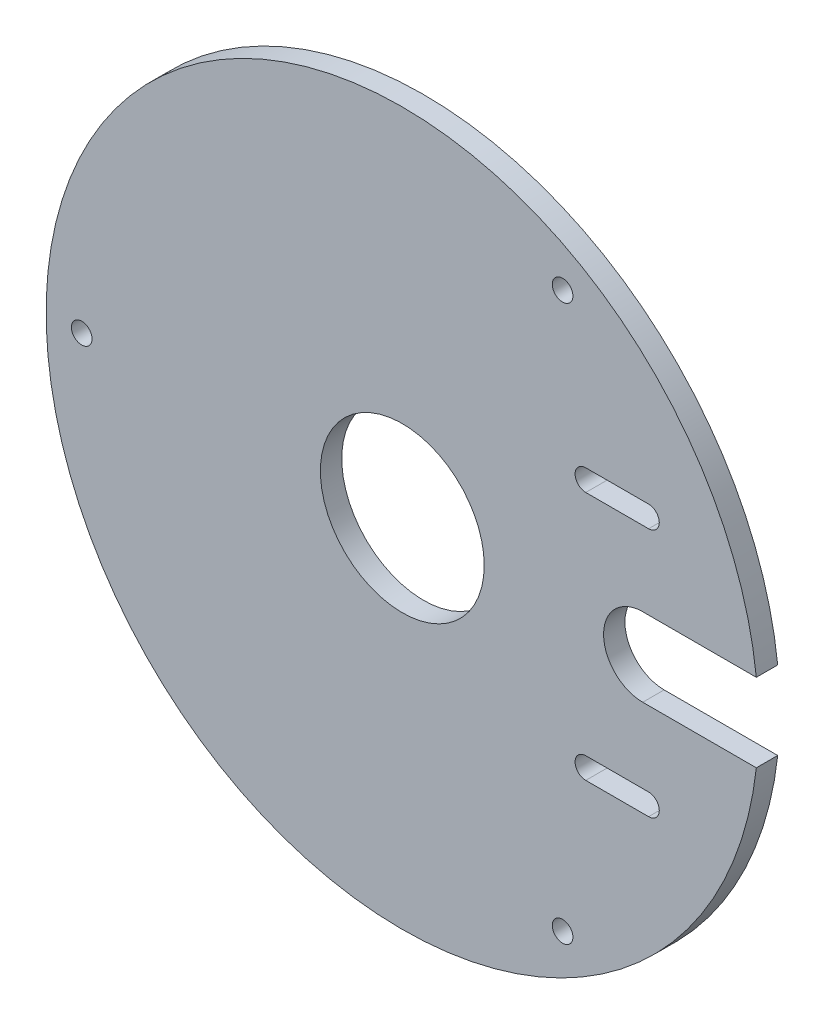
ISO-10303-21;
HEADER;
FILE_DESCRIPTION(('STEP AP214'),'2;1');
FILE_NAME('part.step','',(''),(''),'','','');
FILE_SCHEMA(('AUTOMOTIVE_DESIGN { 1 0 10303 214 1 1 1 1 }'));
ENDSEC;
DATA;
#1=APPLICATION_CONTEXT('core data for automotive mechanical design processes');
#2=APPLICATION_PROTOCOL_DEFINITION('international standard','automotive_design',2000,#1);
#3=PRODUCT_CONTEXT('',#1,'mechanical');
#4=PRODUCT('Part','Part','',(#3));
#5=PRODUCT_RELATED_PRODUCT_CATEGORY('part','',(#4));
#6=PRODUCT_DEFINITION_FORMATION('','',#4);
#7=PRODUCT_DEFINITION_CONTEXT('part definition',#1,'design');
#8=PRODUCT_DEFINITION('design','',#6,#7);
#9=PRODUCT_DEFINITION_SHAPE('','',#8);
#10=(LENGTH_UNIT() NAMED_UNIT(*) SI_UNIT(.MILLI.,.METRE.));
#11=(NAMED_UNIT(*) PLANE_ANGLE_UNIT() SI_UNIT($,.RADIAN.));
#12=(NAMED_UNIT(*) SI_UNIT($,.STERADIAN.) SOLID_ANGLE_UNIT());
#13=UNCERTAINTY_MEASURE_WITH_UNIT(LENGTH_MEASURE(1.E-05),#10,'distance_accuracy_value','');
#14=(GEOMETRIC_REPRESENTATION_CONTEXT(3) GLOBAL_UNCERTAINTY_ASSIGNED_CONTEXT((#13)) GLOBAL_UNIT_ASSIGNED_CONTEXT((#10,
#11,#12)) REPRESENTATION_CONTEXT('',''));
#15=CARTESIAN_POINT('',(0.,0.,0.));
#16=DIRECTION('',(0.,0.,1.));
#17=DIRECTION('',(1.,0.,0.));
#18=AXIS2_PLACEMENT_3D('',#15,#16,#17);
#19=CARTESIAN_POINT('',(0.,0.,3.));
#20=DIRECTION('',(0.,0.,1.));
#21=DIRECTION('',(1.,0.,0.));
#22=AXIS2_PLACEMENT_3D('',#19,#20,#21);
#23=PLANE('',#22);
#24=CARTESIAN_POINT('',(22.5000000000002,38.9711431702996,3.));
#25=DIRECTION('',(0.,0.,1.));
#26=DIRECTION('',(-0.500000000000004,-0.866025403784436,0.));
#27=AXIS2_PLACEMENT_3D('',#24,#25,#26);
#28=CIRCLE('',#27,1.45);
#29=CARTESIAN_POINT('',(21.7750000000002,37.7154063348122,3.));
#30=VERTEX_POINT('',#29);
#31=EDGE_CURVE('E286',#30,#30,#28,.T.);
#32=ORIENTED_EDGE('',*,*,#31,.F.);
#33=EDGE_LOOP('',(#32));
#34=FACE_BOUND('',#33,.T.);
#35=CARTESIAN_POINT('',(0.,0.,3.));
#36=DIRECTION('',(0.,0.,1.));
#37=DIRECTION('',(1.,0.,0.));
#38=AXIS2_PLACEMENT_3D('',#35,#36,#37);
#39=CIRCLE('',#38,11.5);
#40=CARTESIAN_POINT('',(11.5,0.,3.));
#41=VERTEX_POINT('',#40);
#42=EDGE_CURVE('E205',#41,#41,#39,.T.);
#43=ORIENTED_EDGE('',*,*,#42,.F.);
#44=EDGE_LOOP('',(#43));
#45=FACE_BOUND('',#44,.T.);
#46=DIRECTION('',(-1.,0.,0.));
#47=VECTOR('',#46,1.);
#48=CARTESIAN_POINT('',(0.,5.5,3.));
#49=LINE('',#48,#47);
#50=CARTESIAN_POINT('',(49.6965793591471,5.5,3.));
#51=VERTEX_POINT('',#50);
#52=CARTESIAN_POINT('',(33.7538897565406,5.5,3.));
#53=VERTEX_POINT('',#52);
#54=EDGE_CURVE('E200',#51,#53,#49,.T.);
#55=ORIENTED_EDGE('',*,*,#54,.F.);
#56=CARTESIAN_POINT('',(0.,0.,3.));
#57=DIRECTION('',(0.,0.,1.));
#58=DIRECTION('',(1.,0.,0.));
#59=AXIS2_PLACEMENT_3D('',#56,#57,#58);
#60=CIRCLE('',#59,50.);
#61=CARTESIAN_POINT('',(49.6965793591471,-5.5,3.));
#62=VERTEX_POINT('',#61);
#63=EDGE_CURVE('E211',#51,#62,#60,.T.);
#64=ORIENTED_EDGE('',*,*,#63,.T.);
#65=DIRECTION('',(1.,0.,0.));
#66=VECTOR('',#65,1.);
#67=CARTESIAN_POINT('',(0.,-5.5,3.));
#68=LINE('',#67,#66);
#69=CARTESIAN_POINT('',(33.7538897565406,-5.5,3.));
#70=VERTEX_POINT('',#69);
#71=EDGE_CURVE('E197',#70,#62,#68,.T.);
#72=ORIENTED_EDGE('',*,*,#71,.F.);
#73=CARTESIAN_POINT('',(33.7538897565406,0.,3.));
#74=DIRECTION('',(0.,0.,1.));
#75=DIRECTION('',(1.,0.,0.));
#76=AXIS2_PLACEMENT_3D('',#73,#74,#75);
#77=CIRCLE('',#76,5.5);
#78=EDGE_CURVE('E202',#53,#70,#77,.T.);
#79=ORIENTED_EDGE('',*,*,#78,.F.);
#80=EDGE_LOOP('',(#55,#64,#72,#79));
#81=FACE_BOUND('',#80,.T.);
#82=CARTESIAN_POINT('',(34.5735541658757,17.5,3.));
#83=DIRECTION('',(0.,0.,1.));
#84=DIRECTION('',(1.,0.,0.));
#85=AXIS2_PLACEMENT_3D('',#82,#83,#84);
#86=CIRCLE('',#85,1.5);
#87=CARTESIAN_POINT('',(34.5735541658756,16.,3.));
#88=VERTEX_POINT('',#87);
#89=CARTESIAN_POINT('',(34.5735541658756,19.,3.));
#90=VERTEX_POINT('',#89);
#91=EDGE_CURVE('E184',#88,#90,#86,.T.);
#92=ORIENTED_EDGE('',*,*,#91,.F.);
#93=DIRECTION('',(1.,0.,0.));
#94=VECTOR('',#93,1.);
#95=CARTESIAN_POINT('',(0.,16.,3.));
#96=LINE('',#95,#94);
#97=CARTESIAN_POINT('',(25.7538897565406,16.,3.));
#98=VERTEX_POINT('',#97);
#99=EDGE_CURVE('E171',#98,#88,#96,.T.);
#100=ORIENTED_EDGE('',*,*,#99,.F.);
#101=CARTESIAN_POINT('',(25.7538897565406,17.5,3.));
#102=DIRECTION('',(0.,0.,1.));
#103=DIRECTION('',(1.,0.,0.));
#104=AXIS2_PLACEMENT_3D('',#101,#102,#103);
#105=CIRCLE('',#104,1.5);
#106=CARTESIAN_POINT('',(25.7538897565406,19.,3.));
#107=VERTEX_POINT('',#106);
#108=EDGE_CURVE('E179',#107,#98,#105,.T.);
#109=ORIENTED_EDGE('',*,*,#108,.F.);
#110=DIRECTION('',(-1.,0.,0.));
#111=VECTOR('',#110,1.);
#112=CARTESIAN_POINT('',(0.,19.,3.));
#113=LINE('',#112,#111);
#114=EDGE_CURVE('E182',#90,#107,#113,.T.);
#115=ORIENTED_EDGE('',*,*,#114,.F.);
#116=EDGE_LOOP('',(#92,#100,#109,#115));
#117=FACE_BOUND('',#116,.T.);
#118=CARTESIAN_POINT('',(34.5735541658757,-17.5,3.));
#119=DIRECTION('',(0.,0.,1.));
#120=DIRECTION('',(1.,0.,0.));
#121=AXIS2_PLACEMENT_3D('',#118,#119,#120);
#122=CIRCLE('',#121,1.5);
#123=CARTESIAN_POINT('',(34.5735541658756,-19.,3.));
#124=VERTEX_POINT('',#123);
#125=CARTESIAN_POINT('',(34.5735541658756,-16.,3.));
#126=VERTEX_POINT('',#125);
#127=EDGE_CURVE('E155',#124,#126,#122,.T.);
#128=ORIENTED_EDGE('',*,*,#127,.F.);
#129=DIRECTION('',(1.,0.,0.));
#130=VECTOR('',#129,1.);
#131=CARTESIAN_POINT('',(0.,-19.,3.));
#132=LINE('',#131,#130);
#133=CARTESIAN_POINT('',(25.7538897565406,-19.,3.));
#134=VERTEX_POINT('',#133);
#135=EDGE_CURVE('E148',#134,#124,#132,.T.);
#136=ORIENTED_EDGE('',*,*,#135,.F.);
#137=CARTESIAN_POINT('',(25.7538897565406,-17.5,3.));
#138=DIRECTION('',(0.,0.,1.));
#139=DIRECTION('',(1.,0.,0.));
#140=AXIS2_PLACEMENT_3D('',#137,#138,#139);
#141=CIRCLE('',#140,1.5);
#142=CARTESIAN_POINT('',(25.7538897565406,-16.,3.));
#143=VERTEX_POINT('',#142);
#144=EDGE_CURVE('E128',#143,#134,#141,.T.);
#145=ORIENTED_EDGE('',*,*,#144,.F.);
#146=DIRECTION('',(-1.,0.,0.));
#147=VECTOR('',#146,1.);
#148=CARTESIAN_POINT('',(0.,-16.,3.));
#149=LINE('',#148,#147);
#150=EDGE_CURVE('E153',#126,#143,#149,.T.);
#151=ORIENTED_EDGE('',*,*,#150,.F.);
#152=EDGE_LOOP('',(#128,#136,#145,#151));
#153=FACE_BOUND('',#152,.T.);
#154=CARTESIAN_POINT('',(-45.,0.,3.));
#155=DIRECTION('',(0.,0.,1.));
#156=DIRECTION('',(1.,0.,0.));
#157=AXIS2_PLACEMENT_3D('',#154,#155,#156);
#158=CIRCLE('',#157,1.45);
#159=CARTESIAN_POINT('',(-43.55,0.,3.));
#160=VERTEX_POINT('',#159);
#161=EDGE_CURVE('E290',#160,#160,#158,.T.);
#162=ORIENTED_EDGE('',*,*,#161,.F.);
#163=EDGE_LOOP('',(#162));
#164=FACE_BOUND('',#163,.T.);
#165=CARTESIAN_POINT('',(22.4999999999996,-38.9711431702999,3.));
#166=DIRECTION('',(0.,0.,1.));
#167=DIRECTION('',(-0.499999999999992,0.866025403784443,0.));
#168=AXIS2_PLACEMENT_3D('',#165,#166,#167);
#169=CIRCLE('',#168,1.45);
#170=CARTESIAN_POINT('',(21.7749999999997,-37.7154063348125,3.));
#171=VERTEX_POINT('',#170);
#172=EDGE_CURVE('E281',#171,#171,#169,.T.);
#173=ORIENTED_EDGE('',*,*,#172,.F.);
#174=EDGE_LOOP('',(#173));
#175=FACE_BOUND('',#174,.T.);
#176=ADVANCED_FACE('F33',(#34,#45,#81,#117,#153,#164,#175),#23,.T.);
#177=CARTESIAN_POINT('',(0.,0.,0.));
#178=DIRECTION('',(0.,0.,1.));
#179=DIRECTION('',(1.,0.,0.));
#180=AXIS2_PLACEMENT_3D('',#177,#178,#179);
#181=PLANE('',#180);
#182=DIRECTION('',(-1.,0.,0.));
#183=VECTOR('',#182,1.);
#184=CARTESIAN_POINT('',(34.5735541658756,-19.,0.));
#185=LINE('',#184,#183);
#186=CARTESIAN_POINT('',(34.5735541658756,-19.,0.));
#187=VERTEX_POINT('',#186);
#188=CARTESIAN_POINT('',(25.7538897565406,-19.,0.));
#189=VERTEX_POINT('',#188);
#190=EDGE_CURVE('E134',#187,#189,#185,.T.);
#191=ORIENTED_EDGE('',*,*,#190,.F.);
#192=CARTESIAN_POINT('',(34.5735541658757,-17.5,0.));
#193=DIRECTION('',(0.,0.,-1.));
#194=DIRECTION('',(1.,0.,0.));
#195=AXIS2_PLACEMENT_3D('',#192,#193,#194);
#196=CIRCLE('',#195,1.5);
#197=CARTESIAN_POINT('',(34.5735541658756,-16.,0.));
#198=VERTEX_POINT('',#197);
#199=EDGE_CURVE('E56',#198,#187,#196,.T.);
#200=ORIENTED_EDGE('',*,*,#199,.F.);
#201=DIRECTION('',(1.,0.,0.));
#202=VECTOR('',#201,1.);
#203=CARTESIAN_POINT('',(34.5735541658756,-16.,0.));
#204=LINE('',#203,#202);
#205=CARTESIAN_POINT('',(25.7538897565406,-16.,0.));
#206=VERTEX_POINT('',#205);
#207=EDGE_CURVE('E141',#206,#198,#204,.T.);
#208=ORIENTED_EDGE('',*,*,#207,.F.);
#209=CARTESIAN_POINT('',(25.7538897565406,-17.5,0.));
#210=DIRECTION('',(0.,0.,-1.));
#211=DIRECTION('',(1.,0.,0.));
#212=AXIS2_PLACEMENT_3D('',#209,#210,#211);
#213=CIRCLE('',#212,1.5);
#214=EDGE_CURVE('E125',#189,#206,#213,.T.);
#215=ORIENTED_EDGE('',*,*,#214,.F.);
#216=EDGE_LOOP('',(#191,#200,#208,#215));
#217=FACE_BOUND('',#216,.T.);
#218=DIRECTION('',(-1.,0.,0.));
#219=VECTOR('',#218,1.);
#220=CARTESIAN_POINT('',(34.5735541658756,16.,0.));
#221=LINE('',#220,#219);
#222=CARTESIAN_POINT('',(34.5735541658756,16.,0.));
#223=VERTEX_POINT('',#222);
#224=CARTESIAN_POINT('',(25.7538897565406,16.,0.));
#225=VERTEX_POINT('',#224);
#226=EDGE_CURVE('E159',#223,#225,#221,.T.);
#227=ORIENTED_EDGE('',*,*,#226,.F.);
#228=CARTESIAN_POINT('',(34.5735541658757,17.5,0.));
#229=DIRECTION('',(0.,0.,-1.));
#230=DIRECTION('',(-1.,0.,0.));
#231=AXIS2_PLACEMENT_3D('',#228,#229,#230);
#232=CIRCLE('',#231,1.5);
#233=CARTESIAN_POINT('',(34.5735541658756,19.,0.));
#234=VERTEX_POINT('',#233);
#235=EDGE_CURVE('E157',#234,#223,#232,.T.);
#236=ORIENTED_EDGE('',*,*,#235,.F.);
#237=DIRECTION('',(1.,0.,0.));
#238=VECTOR('',#237,1.);
#239=CARTESIAN_POINT('',(34.5735541658756,19.,0.));
#240=LINE('',#239,#238);
#241=CARTESIAN_POINT('',(25.7538897565406,19.,0.));
#242=VERTEX_POINT('',#241);
#243=EDGE_CURVE('E165',#242,#234,#240,.T.);
#244=ORIENTED_EDGE('',*,*,#243,.F.);
#245=CARTESIAN_POINT('',(25.7538897565406,17.5,0.));
#246=DIRECTION('',(0.,0.,-1.));
#247=DIRECTION('',(-1.,0.,0.));
#248=AXIS2_PLACEMENT_3D('',#245,#246,#247);
#249=CIRCLE('',#248,1.5);
#250=EDGE_CURVE('E162',#225,#242,#249,.T.);
#251=ORIENTED_EDGE('',*,*,#250,.F.);
#252=EDGE_LOOP('',(#227,#236,#244,#251));
#253=FACE_BOUND('',#252,.T.);
#254=CARTESIAN_POINT('',(0.,0.,0.));
#255=DIRECTION('',(0.,0.,1.));
#256=DIRECTION('',(1.,0.,0.));
#257=AXIS2_PLACEMENT_3D('',#254,#255,#256);
#258=CIRCLE('',#257,50.);
#259=CARTESIAN_POINT('',(49.6965793591471,5.5,0.));
#260=VERTEX_POINT('',#259);
#261=CARTESIAN_POINT('',(49.6965793591471,-5.5,0.));
#262=VERTEX_POINT('',#261);
#263=EDGE_CURVE('E208',#260,#262,#258,.T.);
#264=ORIENTED_EDGE('',*,*,#263,.F.);
#265=DIRECTION('',(1.,0.,0.));
#266=VECTOR('',#265,1.);
#267=CARTESIAN_POINT('',(50.4926761863821,5.5,0.));
#268=LINE('',#267,#266);
#269=CARTESIAN_POINT('',(33.7538897565406,5.5,0.));
#270=VERTEX_POINT('',#269);
#271=EDGE_CURVE('E192',#270,#260,#268,.T.);
#272=ORIENTED_EDGE('',*,*,#271,.F.);
#273=CARTESIAN_POINT('',(33.7538897565406,0.,0.));
#274=DIRECTION('',(0.,0.,-1.));
#275=DIRECTION('',(-1.,0.,0.));
#276=AXIS2_PLACEMENT_3D('',#273,#274,#275);
#277=CIRCLE('',#276,5.5);
#278=CARTESIAN_POINT('',(33.7538897565406,-5.5,0.));
#279=VERTEX_POINT('',#278);
#280=EDGE_CURVE('E189',#279,#270,#277,.T.);
#281=ORIENTED_EDGE('',*,*,#280,.F.);
#282=DIRECTION('',(-1.,0.,0.));
#283=VECTOR('',#282,1.);
#284=CARTESIAN_POINT('',(50.4926761863821,-5.5,0.));
#285=LINE('',#284,#283);
#286=EDGE_CURVE('E186',#262,#279,#285,.T.);
#287=ORIENTED_EDGE('',*,*,#286,.F.);
#288=EDGE_LOOP('',(#264,#272,#281,#287));
#289=FACE_BOUND('',#288,.T.);
#290=CARTESIAN_POINT('',(0.,0.,0.));
#291=DIRECTION('',(0.,0.,1.));
#292=DIRECTION('',(1.,0.,0.));
#293=AXIS2_PLACEMENT_3D('',#290,#291,#292);
#294=CIRCLE('',#293,11.5);
#295=CARTESIAN_POINT('',(11.5,0.,0.));
#296=VERTEX_POINT('',#295);
#297=EDGE_CURVE('E204',#296,#296,#294,.T.);
#298=ORIENTED_EDGE('',*,*,#297,.T.);
#299=EDGE_LOOP('',(#298));
#300=FACE_BOUND('',#299,.T.);
#301=CARTESIAN_POINT('',(-45.,0.,0.));
#302=DIRECTION('',(0.,0.,1.));
#303=DIRECTION('',(1.,0.,0.));
#304=AXIS2_PLACEMENT_3D('',#301,#302,#303);
#305=CIRCLE('',#304,1.45);
#306=CARTESIAN_POINT('',(-43.55,0.,0.));
#307=VERTEX_POINT('',#306);
#308=EDGE_CURVE('E272',#307,#307,#305,.T.);
#309=ORIENTED_EDGE('',*,*,#308,.T.);
#310=EDGE_LOOP('',(#309));
#311=FACE_BOUND('',#310,.T.);
#312=CARTESIAN_POINT('',(22.5000000000002,38.9711431702996,0.));
#313=DIRECTION('',(0.,0.,1.));
#314=DIRECTION('',(-0.500000000000004,-0.866025403784436,0.));
#315=AXIS2_PLACEMENT_3D('',#312,#313,#314);
#316=CIRCLE('',#315,1.45);
#317=CARTESIAN_POINT('',(21.7750000000002,37.7154063348122,0.));
#318=VERTEX_POINT('',#317);
#319=EDGE_CURVE('E276',#318,#318,#316,.T.);
#320=ORIENTED_EDGE('',*,*,#319,.T.);
#321=EDGE_LOOP('',(#320));
#322=FACE_BOUND('',#321,.T.);
#323=CARTESIAN_POINT('',(22.4999999999996,-38.9711431702999,0.));
#324=DIRECTION('',(0.,0.,1.));
#325=DIRECTION('',(-0.499999999999992,0.866025403784443,0.));
#326=AXIS2_PLACEMENT_3D('',#323,#324,#325);
#327=CIRCLE('',#326,1.45);
#328=CARTESIAN_POINT('',(21.7749999999997,-37.7154063348125,0.));
#329=VERTEX_POINT('',#328);
#330=EDGE_CURVE('E279',#329,#329,#327,.T.);
#331=ORIENTED_EDGE('',*,*,#330,.T.);
#332=EDGE_LOOP('',(#331));
#333=FACE_BOUND('',#332,.T.);
#334=ADVANCED_FACE('F138',(#217,#253,#289,#300,#311,#322,#333),#181,.F.);
#335=CARTESIAN_POINT('',(0.,0.,3.));
#336=DIRECTION('',(0.,0.,-1.));
#337=DIRECTION('',(-1.,0.,0.));
#338=AXIS2_PLACEMENT_3D('',#335,#336,#337);
#339=CYLINDRICAL_SURFACE('',#338,50.);
#340=ORIENTED_EDGE('',*,*,#63,.F.);
#341=DIRECTION('',(0.,0.,-1.));
#342=VECTOR('',#341,1.);
#343=CARTESIAN_POINT('',(49.6965793591471,5.5,3.));
#344=LINE('',#343,#342);
#345=EDGE_CURVE('E11',#51,#260,#344,.T.);
#346=ORIENTED_EDGE('',*,*,#345,.T.);
#347=ORIENTED_EDGE('',*,*,#263,.T.);
#348=DIRECTION('',(0.,0.,-1.));
#349=VECTOR('',#348,1.);
#350=CARTESIAN_POINT('',(49.6965793591471,-5.5,3.));
#351=LINE('',#350,#349);
#352=EDGE_CURVE('E41',#262,#62,#351,.F.);
#353=ORIENTED_EDGE('',*,*,#352,.T.);
#354=EDGE_LOOP('',(#340,#346,#347,#353));
#355=FACE_BOUND('',#354,.T.);
#356=ADVANCED_FACE('F35',(#355),#339,.T.);
#357=CARTESIAN_POINT('',(0.,0.,3.));
#358=DIRECTION('',(0.,0.,-1.));
#359=DIRECTION('',(-1.,0.,0.));
#360=AXIS2_PLACEMENT_3D('',#357,#358,#359);
#361=CYLINDRICAL_SURFACE('',#360,11.5);
#362=ORIENTED_EDGE('',*,*,#42,.T.);
#363=EDGE_LOOP('',(#362));
#364=FACE_BOUND('',#363,.T.);
#365=ORIENTED_EDGE('',*,*,#297,.F.);
#366=EDGE_LOOP('',(#365));
#367=FACE_BOUND('',#366,.T.);
#368=ADVANCED_FACE('F257',(#364,#367),#361,.F.);
#369=CARTESIAN_POINT('',(50.4926761863821,5.5,4.));
#370=DIRECTION('',(0.,1.,0.));
#371=DIRECTION('',(0.,0.,1.));
#372=AXIS2_PLACEMENT_3D('',#369,#370,#371);
#373=PLANE('',#372);
#374=ORIENTED_EDGE('',*,*,#54,.T.);
#375=DIRECTION('',(0.,0.,-1.));
#376=VECTOR('',#375,1.);
#377=CARTESIAN_POINT('',(33.7538897565406,5.5,4.));
#378=LINE('',#377,#376);
#379=EDGE_CURVE('E195',#53,#270,#378,.T.);
#380=ORIENTED_EDGE('',*,*,#379,.T.);
#381=ORIENTED_EDGE('',*,*,#271,.T.);
#382=ORIENTED_EDGE('',*,*,#345,.F.);
#383=EDGE_LOOP('',(#374,#380,#381,#382));
#384=FACE_BOUND('',#383,.T.);
#385=ADVANCED_FACE('F228',(#384),#373,.F.);
#386=CARTESIAN_POINT('',(33.7538897565406,0.,4.));
#387=DIRECTION('',(0.,0.,-1.));
#388=DIRECTION('',(-1.,0.,0.));
#389=AXIS2_PLACEMENT_3D('',#386,#387,#388);
#390=CYLINDRICAL_SURFACE('',#389,5.5);
#391=ORIENTED_EDGE('',*,*,#78,.T.);
#392=DIRECTION('',(0.,0.,-1.));
#393=VECTOR('',#392,1.);
#394=CARTESIAN_POINT('',(33.7538897565406,-5.5,4.));
#395=LINE('',#394,#393);
#396=EDGE_CURVE('E194',#70,#279,#395,.T.);
#397=ORIENTED_EDGE('',*,*,#396,.T.);
#398=ORIENTED_EDGE('',*,*,#280,.T.);
#399=ORIENTED_EDGE('',*,*,#379,.F.);
#400=EDGE_LOOP('',(#391,#397,#398,#399));
#401=FACE_BOUND('',#400,.T.);
#402=ADVANCED_FACE('F230',(#401),#390,.F.);
#403=CARTESIAN_POINT('',(50.4926761863821,-5.5,4.));
#404=DIRECTION('',(0.,-1.,0.));
#405=DIRECTION('',(0.,0.,-1.));
#406=AXIS2_PLACEMENT_3D('',#403,#404,#405);
#407=PLANE('',#406);
#408=ORIENTED_EDGE('',*,*,#71,.T.);
#409=ORIENTED_EDGE('',*,*,#352,.F.);
#410=ORIENTED_EDGE('',*,*,#286,.T.);
#411=ORIENTED_EDGE('',*,*,#396,.F.);
#412=EDGE_LOOP('',(#408,#409,#410,#411));
#413=FACE_BOUND('',#412,.T.);
#414=ADVANCED_FACE('F236',(#413),#407,.F.);
#415=CARTESIAN_POINT('',(34.5735541658757,17.5,4.));
#416=DIRECTION('',(0.,0.,-1.));
#417=DIRECTION('',(-1.,0.,0.));
#418=AXIS2_PLACEMENT_3D('',#415,#416,#417);
#419=CYLINDRICAL_SURFACE('',#418,1.5);
#420=ORIENTED_EDGE('',*,*,#91,.T.);
#421=DIRECTION('',(0.,0.,-1.));
#422=VECTOR('',#421,1.);
#423=CARTESIAN_POINT('',(34.5735541658756,19.,4.));
#424=LINE('',#423,#422);
#425=EDGE_CURVE('E169',#90,#234,#424,.T.);
#426=ORIENTED_EDGE('',*,*,#425,.T.);
#427=ORIENTED_EDGE('',*,*,#235,.T.);
#428=DIRECTION('',(0.,0.,-1.));
#429=VECTOR('',#428,1.);
#430=CARTESIAN_POINT('',(34.5735541658756,16.,4.));
#431=LINE('',#430,#429);
#432=EDGE_CURVE('E168',#88,#223,#431,.T.);
#433=ORIENTED_EDGE('',*,*,#432,.F.);
#434=EDGE_LOOP('',(#420,#426,#427,#433));
#435=FACE_BOUND('',#434,.T.);
#436=ADVANCED_FACE('F238',(#435),#419,.F.);
#437=CARTESIAN_POINT('',(34.5735541658756,19.,4.));
#438=DIRECTION('',(0.,1.,0.));
#439=DIRECTION('',(0.,0.,1.));
#440=AXIS2_PLACEMENT_3D('',#437,#438,#439);
#441=PLANE('',#440);
#442=ORIENTED_EDGE('',*,*,#114,.T.);
#443=DIRECTION('',(0.,0.,-1.));
#444=VECTOR('',#443,1.);
#445=CARTESIAN_POINT('',(25.7538897565406,19.,4.));
#446=LINE('',#445,#444);
#447=EDGE_CURVE('E172',#107,#242,#446,.T.);
#448=ORIENTED_EDGE('',*,*,#447,.T.);
#449=ORIENTED_EDGE('',*,*,#243,.T.);
#450=ORIENTED_EDGE('',*,*,#425,.F.);
#451=EDGE_LOOP('',(#442,#448,#449,#450));
#452=FACE_BOUND('',#451,.T.);
#453=ADVANCED_FACE('F244',(#452),#441,.F.);
#454=CARTESIAN_POINT('',(25.7538897565406,17.5,4.));
#455=DIRECTION('',(0.,0.,-1.));
#456=DIRECTION('',(-1.,0.,0.));
#457=AXIS2_PLACEMENT_3D('',#454,#455,#456);
#458=CYLINDRICAL_SURFACE('',#457,1.5);
#459=ORIENTED_EDGE('',*,*,#108,.T.);
#460=DIRECTION('',(0.,0.,-1.));
#461=VECTOR('',#460,1.);
#462=CARTESIAN_POINT('',(25.7538897565406,16.,4.));
#463=LINE('',#462,#461);
#464=EDGE_CURVE('E174',#98,#225,#463,.T.);
#465=ORIENTED_EDGE('',*,*,#464,.T.);
#466=ORIENTED_EDGE('',*,*,#250,.T.);
#467=ORIENTED_EDGE('',*,*,#447,.F.);
#468=EDGE_LOOP('',(#459,#465,#466,#467));
#469=FACE_BOUND('',#468,.T.);
#470=ADVANCED_FACE('F327',(#469),#458,.F.);
#471=CARTESIAN_POINT('',(34.5735541658756,16.,4.));
#472=DIRECTION('',(0.,-1.,0.));
#473=DIRECTION('',(0.,0.,-1.));
#474=AXIS2_PLACEMENT_3D('',#471,#472,#473);
#475=PLANE('',#474);
#476=ORIENTED_EDGE('',*,*,#99,.T.);
#477=ORIENTED_EDGE('',*,*,#432,.T.);
#478=ORIENTED_EDGE('',*,*,#226,.T.);
#479=ORIENTED_EDGE('',*,*,#464,.F.);
#480=EDGE_LOOP('',(#476,#477,#478,#479));
#481=FACE_BOUND('',#480,.T.);
#482=ADVANCED_FACE('F324',(#481),#475,.F.);
#483=CARTESIAN_POINT('',(34.5735541658757,-17.5,4.));
#484=DIRECTION('',(0.,0.,-1.));
#485=DIRECTION('',(-1.,0.,0.));
#486=AXIS2_PLACEMENT_3D('',#483,#484,#485);
#487=CYLINDRICAL_SURFACE('',#486,1.5);
#488=ORIENTED_EDGE('',*,*,#127,.T.);
#489=DIRECTION('',(0.,0.,-1.));
#490=VECTOR('',#489,1.);
#491=CARTESIAN_POINT('',(34.5735541658756,-16.,4.));
#492=LINE('',#491,#490);
#493=EDGE_CURVE('E146',#126,#198,#492,.T.);
#494=ORIENTED_EDGE('',*,*,#493,.T.);
#495=ORIENTED_EDGE('',*,*,#199,.T.);
#496=DIRECTION('',(0.,0.,-1.));
#497=VECTOR('',#496,1.);
#498=CARTESIAN_POINT('',(34.5735541658756,-19.,4.));
#499=LINE('',#498,#497);
#500=EDGE_CURVE('E131',#124,#187,#499,.T.);
#501=ORIENTED_EDGE('',*,*,#500,.F.);
#502=EDGE_LOOP('',(#488,#494,#495,#501));
#503=FACE_BOUND('',#502,.T.);
#504=ADVANCED_FACE('F316',(#503),#487,.F.);
#505=CARTESIAN_POINT('',(34.5735541658756,-16.,4.));
#506=DIRECTION('',(0.,1.,0.));
#507=DIRECTION('',(0.,0.,1.));
#508=AXIS2_PLACEMENT_3D('',#505,#506,#507);
#509=PLANE('',#508);
#510=ORIENTED_EDGE('',*,*,#150,.T.);
#511=DIRECTION('',(0.,0.,-1.));
#512=VECTOR('',#511,1.);
#513=CARTESIAN_POINT('',(25.7538897565406,-16.,4.));
#514=LINE('',#513,#512);
#515=EDGE_CURVE('E130',#143,#206,#514,.T.);
#516=ORIENTED_EDGE('',*,*,#515,.T.);
#517=ORIENTED_EDGE('',*,*,#207,.T.);
#518=ORIENTED_EDGE('',*,*,#493,.F.);
#519=EDGE_LOOP('',(#510,#516,#517,#518));
#520=FACE_BOUND('',#519,.T.);
#521=ADVANCED_FACE('F313',(#520),#509,.F.);
#522=CARTESIAN_POINT('',(25.7538897565406,-17.5,4.));
#523=DIRECTION('',(0.,0.,-1.));
#524=DIRECTION('',(-1.,0.,0.));
#525=AXIS2_PLACEMENT_3D('',#522,#523,#524);
#526=CYLINDRICAL_SURFACE('',#525,1.5);
#527=ORIENTED_EDGE('',*,*,#144,.T.);
#528=DIRECTION('',(0.,0.,-1.));
#529=VECTOR('',#528,1.);
#530=CARTESIAN_POINT('',(25.7538897565406,-19.,4.));
#531=LINE('',#530,#529);
#532=EDGE_CURVE('E48',#134,#189,#531,.T.);
#533=ORIENTED_EDGE('',*,*,#532,.T.);
#534=ORIENTED_EDGE('',*,*,#214,.T.);
#535=ORIENTED_EDGE('',*,*,#515,.F.);
#536=EDGE_LOOP('',(#527,#533,#534,#535));
#537=FACE_BOUND('',#536,.T.);
#538=ADVANCED_FACE('F122',(#537),#526,.F.);
#539=CARTESIAN_POINT('',(34.5735541658756,-19.,4.));
#540=DIRECTION('',(0.,-1.,0.));
#541=DIRECTION('',(0.,0.,-1.));
#542=AXIS2_PLACEMENT_3D('',#539,#540,#541);
#543=PLANE('',#542);
#544=ORIENTED_EDGE('',*,*,#135,.T.);
#545=ORIENTED_EDGE('',*,*,#500,.T.);
#546=ORIENTED_EDGE('',*,*,#190,.T.);
#547=ORIENTED_EDGE('',*,*,#532,.F.);
#548=EDGE_LOOP('',(#544,#545,#546,#547));
#549=FACE_BOUND('',#548,.T.);
#550=ADVANCED_FACE('F135',(#549),#543,.F.);
#551=CARTESIAN_POINT('',(-45.,0.,3.));
#552=DIRECTION('',(0.,0.,-1.));
#553=DIRECTION('',(-1.,0.,0.));
#554=AXIS2_PLACEMENT_3D('',#551,#552,#553);
#555=CYLINDRICAL_SURFACE('',#554,1.45);
#556=ORIENTED_EDGE('',*,*,#161,.T.);
#557=EDGE_LOOP('',(#556));
#558=FACE_BOUND('',#557,.T.);
#559=ORIENTED_EDGE('',*,*,#308,.F.);
#560=EDGE_LOOP('',(#559));
#561=FACE_BOUND('',#560,.T.);
#562=ADVANCED_FACE('F295',(#558,#561),#555,.F.);
#563=CARTESIAN_POINT('',(22.5000000000002,38.9711431702996,3.));
#564=DIRECTION('',(0.,0.,-1.));
#565=DIRECTION('',(-1.,0.,0.));
#566=AXIS2_PLACEMENT_3D('',#563,#564,#565);
#567=CYLINDRICAL_SURFACE('',#566,1.45);
#568=ORIENTED_EDGE('',*,*,#31,.T.);
#569=EDGE_LOOP('',(#568));
#570=FACE_BOUND('',#569,.T.);
#571=ORIENTED_EDGE('',*,*,#319,.F.);
#572=EDGE_LOOP('',(#571));
#573=FACE_BOUND('',#572,.T.);
#574=ADVANCED_FACE('F303',(#570,#573),#567,.F.);
#575=CARTESIAN_POINT('',(22.4999999999996,-38.9711431702999,3.));
#576=DIRECTION('',(0.,0.,-1.));
#577=DIRECTION('',(-1.,0.,0.));
#578=AXIS2_PLACEMENT_3D('',#575,#576,#577);
#579=CYLINDRICAL_SURFACE('',#578,1.45);
#580=ORIENTED_EDGE('',*,*,#172,.T.);
#581=EDGE_LOOP('',(#580));
#582=FACE_BOUND('',#581,.T.);
#583=ORIENTED_EDGE('',*,*,#330,.F.);
#584=EDGE_LOOP('',(#583));
#585=FACE_BOUND('',#584,.T.);
#586=ADVANCED_FACE('F301',(#582,#585),#579,.F.);
#587=CLOSED_SHELL('',(#176,#334,#356,#368,#385,#402,#414,#436,#453,#470,#482,#504,#521,#538,
#550,#562,#574,#586));
#588=MANIFOLD_SOLID_BREP('B2',#587);
#589=ADVANCED_BREP_SHAPE_REPRESENTATION('',(#18,#588),#14);
#590=SHAPE_DEFINITION_REPRESENTATION(#9,#589);
ENDSEC;
END-ISO-10303-21;
